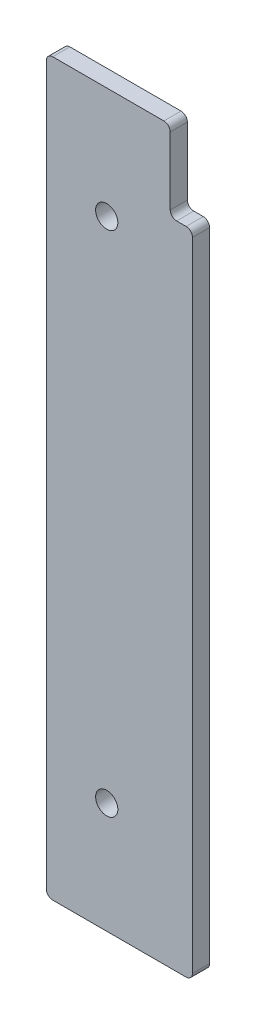
ISO-10303-21;
HEADER;
FILE_DESCRIPTION(('STEP AP214'),'2;1');
FILE_NAME('part.step','',(''),(''),'','','');
FILE_SCHEMA(('AUTOMOTIVE_DESIGN { 1 0 10303 214 1 1 1 1 }'));
ENDSEC;
DATA;
#1=APPLICATION_CONTEXT('core data for automotive mechanical design processes');
#2=APPLICATION_PROTOCOL_DEFINITION('international standard','automotive_design',2000,#1);
#3=PRODUCT_CONTEXT('',#1,'mechanical');
#4=PRODUCT('Part','Part','',(#3));
#5=PRODUCT_RELATED_PRODUCT_CATEGORY('part','',(#4));
#6=PRODUCT_DEFINITION_FORMATION('','',#4);
#7=PRODUCT_DEFINITION_CONTEXT('part definition',#1,'design');
#8=PRODUCT_DEFINITION('design','',#6,#7);
#9=PRODUCT_DEFINITION_SHAPE('','',#8);
#10=(LENGTH_UNIT() NAMED_UNIT(*) SI_UNIT(.MILLI.,.METRE.));
#11=(NAMED_UNIT(*) PLANE_ANGLE_UNIT() SI_UNIT($,.RADIAN.));
#12=(NAMED_UNIT(*) SI_UNIT($,.STERADIAN.) SOLID_ANGLE_UNIT());
#13=UNCERTAINTY_MEASURE_WITH_UNIT(LENGTH_MEASURE(1.E-05),#10,'distance_accuracy_value','');
#14=(GEOMETRIC_REPRESENTATION_CONTEXT(3) GLOBAL_UNCERTAINTY_ASSIGNED_CONTEXT((#13)) GLOBAL_UNIT_ASSIGNED_CONTEXT((#10,
#11,#12)) REPRESENTATION_CONTEXT('',''));
#15=CARTESIAN_POINT('',(0.,0.,0.));
#16=DIRECTION('',(0.,0.,1.));
#17=DIRECTION('',(1.,0.,0.));
#18=AXIS2_PLACEMENT_3D('',#15,#16,#17);
#19=CARTESIAN_POINT('',(142.500000000002,204.819306835417,2.7));
#20=DIRECTION('',(0.,0.,-1.));
#21=DIRECTION('',(-1.,0.,0.));
#22=AXIS2_PLACEMENT_3D('',#19,#20,#21);
#23=PLANE('',#22);
#24=CARTESIAN_POINT('',(142.500000000002,204.819306835417,2.7));
#25=DIRECTION('',(0.,0.,1.));
#26=DIRECTION('',(-1.,0.,0.));
#27=AXIS2_PLACEMENT_3D('',#24,#25,#26);
#28=CIRCLE('',#27,1.);
#29=CARTESIAN_POINT('',(143.500000000002,204.819306835417,2.7));
#30=VERTEX_POINT('',#29);
#31=CARTESIAN_POINT('',(142.500000000002,205.819306835417,2.7));
#32=VERTEX_POINT('',#31);
#33=EDGE_CURVE('E204',#30,#32,#28,.T.);
#34=ORIENTED_EDGE('',*,*,#33,.T.);
#35=DIRECTION('',(-1.,0.,0.));
#36=VECTOR('',#35,1.);
#37=CARTESIAN_POINT('',(142.500000000002,205.819306835417,2.7));
#38=LINE('',#37,#36);
#39=CARTESIAN_POINT('',(141.000000000002,205.819306835417,2.7));
#40=VERTEX_POINT('',#39);
#41=EDGE_CURVE('E116',#32,#40,#38,.T.);
#42=ORIENTED_EDGE('',*,*,#41,.T.);
#43=CARTESIAN_POINT('',(141.000000000002,206.819306835417,2.7));
#44=DIRECTION('',(0.,0.,-1.));
#45=DIRECTION('',(-1.,0.,0.));
#46=AXIS2_PLACEMENT_3D('',#43,#44,#45);
#47=CIRCLE('',#46,1.);
#48=CARTESIAN_POINT('',(140.000000000002,206.819306835417,2.7));
#49=VERTEX_POINT('',#48);
#50=EDGE_CURVE('E241',#40,#49,#47,.T.);
#51=ORIENTED_EDGE('',*,*,#50,.T.);
#52=DIRECTION('',(0.,1.,0.));
#53=VECTOR('',#52,1.);
#54=CARTESIAN_POINT('',(140.000000000002,206.819306835417,2.7));
#55=LINE('',#54,#53);
#56=CARTESIAN_POINT('',(140.000000000002,217.457909005974,2.7));
#57=VERTEX_POINT('',#56);
#58=EDGE_CURVE('E261',#49,#57,#55,.T.);
#59=ORIENTED_EDGE('',*,*,#58,.T.);
#60=CARTESIAN_POINT('',(139.000000000002,217.457909005974,2.7));
#61=DIRECTION('',(0.,0.,1.));
#62=DIRECTION('',(1.,0.,0.));
#63=AXIS2_PLACEMENT_3D('',#60,#61,#62);
#64=CIRCLE('',#63,1.);
#65=CARTESIAN_POINT('',(139.000000000002,218.457909005974,2.7));
#66=VERTEX_POINT('',#65);
#67=EDGE_CURVE('E257',#57,#66,#64,.T.);
#68=ORIENTED_EDGE('',*,*,#67,.T.);
#69=DIRECTION('',(-1.,0.,0.));
#70=VECTOR('',#69,1.);
#71=CARTESIAN_POINT('',(121.500000000002,218.457909005974,2.7));
#72=LINE('',#71,#70);
#73=CARTESIAN_POINT('',(121.500000000002,218.457909005974,2.7));
#74=VERTEX_POINT('',#73);
#75=EDGE_CURVE('E260',#66,#74,#72,.T.);
#76=ORIENTED_EDGE('',*,*,#75,.T.);
#77=CARTESIAN_POINT('',(121.500000000002,217.457909005974,2.7));
#78=DIRECTION('',(0.,0.,1.));
#79=DIRECTION('',(1.,0.,0.));
#80=AXIS2_PLACEMENT_3D('',#77,#78,#79);
#81=CIRCLE('',#80,1.);
#82=CARTESIAN_POINT('',(120.500000000002,217.457909005974,2.7));
#83=VERTEX_POINT('',#82);
#84=EDGE_CURVE('E265',#74,#83,#81,.T.);
#85=ORIENTED_EDGE('',*,*,#84,.T.);
#86=DIRECTION('',(0.,-1.,0.));
#87=VECTOR('',#86,1.);
#88=CARTESIAN_POINT('',(120.500000000002,217.457909005974,2.7));
#89=LINE('',#88,#87);
#90=CARTESIAN_POINT('',(120.500000000002,104.457909005974,2.7));
#91=VERTEX_POINT('',#90);
#92=EDGE_CURVE('E272',#83,#91,#89,.T.);
#93=ORIENTED_EDGE('',*,*,#92,.T.);
#94=CARTESIAN_POINT('',(121.500000000002,104.457909005974,2.7));
#95=DIRECTION('',(0.,0.,1.));
#96=DIRECTION('',(1.,0.,0.));
#97=AXIS2_PLACEMENT_3D('',#94,#95,#96);
#98=CIRCLE('',#97,1.);
#99=CARTESIAN_POINT('',(121.500000000002,103.457909005974,2.7));
#100=VERTEX_POINT('',#99);
#101=EDGE_CURVE('E147',#91,#100,#98,.T.);
#102=ORIENTED_EDGE('',*,*,#101,.T.);
#103=DIRECTION('',(1.,0.,0.));
#104=VECTOR('',#103,1.);
#105=CARTESIAN_POINT('',(121.500000000002,103.457909005974,2.7));
#106=LINE('',#105,#104);
#107=CARTESIAN_POINT('',(142.500000000002,103.457909005974,2.7));
#108=VERTEX_POINT('',#107);
#109=EDGE_CURVE('E141',#100,#108,#106,.T.);
#110=ORIENTED_EDGE('',*,*,#109,.T.);
#111=CARTESIAN_POINT('',(142.500000000002,104.457909005974,2.7));
#112=DIRECTION('',(0.,0.,1.));
#113=DIRECTION('',(1.,0.,0.));
#114=AXIS2_PLACEMENT_3D('',#111,#112,#113);
#115=CIRCLE('',#114,1.);
#116=CARTESIAN_POINT('',(143.500000000002,104.457909005974,2.7));
#117=VERTEX_POINT('',#116);
#118=EDGE_CURVE('E145',#108,#117,#115,.T.);
#119=ORIENTED_EDGE('',*,*,#118,.T.);
#120=DIRECTION('',(0.,1.,0.));
#121=VECTOR('',#120,1.);
#122=CARTESIAN_POINT('',(143.500000000002,204.819306835417,2.7));
#123=LINE('',#122,#121);
#124=EDGE_CURVE('E61',#117,#30,#123,.T.);
#125=ORIENTED_EDGE('',*,*,#124,.T.);
#126=EDGE_LOOP('',(#34,#42,#51,#59,#68,#76,#85,#93,#102,#110,#119,#125));
#127=FACE_BOUND('',#126,.T.);
#128=CARTESIAN_POINT('',(130.000000000002,200.941258447184,2.7));
#129=DIRECTION('',(0.,0.,1.));
#130=DIRECTION('',(1.,0.,0.));
#131=AXIS2_PLACEMENT_3D('',#128,#129,#130);
#132=CIRCLE('',#131,1.75000000000001);
#133=CARTESIAN_POINT('',(128.250000000002,200.941258447184,2.7));
#134=VERTEX_POINT('',#133);
#135=EDGE_CURVE('E174',#134,#134,#132,.T.);
#136=ORIENTED_EDGE('',*,*,#135,.F.);
#137=EDGE_LOOP('',(#136));
#138=FACE_BOUND('',#137,.T.);
#139=CARTESIAN_POINT('',(130.000000000002,120.941258447184,2.7));
#140=DIRECTION('',(0.,0.,1.));
#141=DIRECTION('',(1.,0.,0.));
#142=AXIS2_PLACEMENT_3D('',#139,#140,#141);
#143=CIRCLE('',#142,1.75000000000001);
#144=CARTESIAN_POINT('',(128.250000000002,120.941258447184,2.7));
#145=VERTEX_POINT('',#144);
#146=EDGE_CURVE('E315',#145,#145,#143,.T.);
#147=ORIENTED_EDGE('',*,*,#146,.F.);
#148=EDGE_LOOP('',(#147));
#149=FACE_BOUND('',#148,.T.);
#150=ADVANCED_FACE('F43',(#127,#138,#149),#23,.F.);
#151=CARTESIAN_POINT('',(142.500000000002,204.819306835417,0.));
#152=DIRECTION('',(0.,0.,-1.));
#153=DIRECTION('',(-1.,0.,0.));
#154=AXIS2_PLACEMENT_3D('',#151,#152,#153);
#155=PLANE('',#154);
#156=CARTESIAN_POINT('',(130.000000000002,200.941258447184,0.));
#157=DIRECTION('',(0.,0.,1.));
#158=DIRECTION('',(1.,0.,0.));
#159=AXIS2_PLACEMENT_3D('',#156,#157,#158);
#160=CIRCLE('',#159,1.75000000000001);
#161=CARTESIAN_POINT('',(128.250000000002,200.941258447184,0.));
#162=VERTEX_POINT('',#161);
#163=EDGE_CURVE('E322',#162,#162,#160,.T.);
#164=ORIENTED_EDGE('',*,*,#163,.T.);
#165=EDGE_LOOP('',(#164));
#166=FACE_BOUND('',#165,.T.);
#167=CARTESIAN_POINT('',(142.500000000002,204.819306835417,0.));
#168=DIRECTION('',(0.,0.,1.));
#169=DIRECTION('',(-1.,0.,0.));
#170=AXIS2_PLACEMENT_3D('',#167,#168,#169);
#171=CIRCLE('',#170,1.);
#172=CARTESIAN_POINT('',(143.500000000002,204.819306835417,0.));
#173=VERTEX_POINT('',#172);
#174=CARTESIAN_POINT('',(142.500000000002,205.819306835417,0.));
#175=VERTEX_POINT('',#174);
#176=EDGE_CURVE('E169',#173,#175,#171,.T.);
#177=ORIENTED_EDGE('',*,*,#176,.F.);
#178=DIRECTION('',(0.,1.,0.));
#179=VECTOR('',#178,1.);
#180=CARTESIAN_POINT('',(143.500000000002,204.819306835417,0.));
#181=LINE('',#180,#179);
#182=CARTESIAN_POINT('',(143.500000000002,104.457909005974,0.));
#183=VERTEX_POINT('',#182);
#184=EDGE_CURVE('E108',#183,#173,#181,.T.);
#185=ORIENTED_EDGE('',*,*,#184,.F.);
#186=CARTESIAN_POINT('',(142.500000000002,104.457909005974,0.));
#187=DIRECTION('',(0.,0.,1.));
#188=DIRECTION('',(1.,0.,0.));
#189=AXIS2_PLACEMENT_3D('',#186,#187,#188);
#190=CIRCLE('',#189,1.);
#191=CARTESIAN_POINT('',(142.500000000002,103.457909005974,0.));
#192=VERTEX_POINT('',#191);
#193=EDGE_CURVE('E102',#192,#183,#190,.T.);
#194=ORIENTED_EDGE('',*,*,#193,.F.);
#195=DIRECTION('',(1.,0.,0.));
#196=VECTOR('',#195,1.);
#197=CARTESIAN_POINT('',(121.500000000002,103.457909005974,0.));
#198=LINE('',#197,#196);
#199=CARTESIAN_POINT('',(121.500000000002,103.457909005974,0.));
#200=VERTEX_POINT('',#199);
#201=EDGE_CURVE('E156',#200,#192,#198,.T.);
#202=ORIENTED_EDGE('',*,*,#201,.F.);
#203=CARTESIAN_POINT('',(121.500000000002,104.457909005974,0.));
#204=DIRECTION('',(0.,0.,1.));
#205=DIRECTION('',(1.,0.,0.));
#206=AXIS2_PLACEMENT_3D('',#203,#204,#205);
#207=CIRCLE('',#206,1.);
#208=CARTESIAN_POINT('',(120.500000000002,104.457909005974,0.));
#209=VERTEX_POINT('',#208);
#210=EDGE_CURVE('E195',#209,#200,#207,.T.);
#211=ORIENTED_EDGE('',*,*,#210,.F.);
#212=DIRECTION('',(0.,-1.,0.));
#213=VECTOR('',#212,1.);
#214=CARTESIAN_POINT('',(120.500000000002,217.457909005974,0.));
#215=LINE('',#214,#213);
#216=CARTESIAN_POINT('',(120.500000000002,217.457909005974,0.));
#217=VERTEX_POINT('',#216);
#218=EDGE_CURVE('E192',#217,#209,#215,.T.);
#219=ORIENTED_EDGE('',*,*,#218,.F.);
#220=CARTESIAN_POINT('',(121.500000000002,217.457909005974,0.));
#221=DIRECTION('',(0.,0.,1.));
#222=DIRECTION('',(1.,0.,0.));
#223=AXIS2_PLACEMENT_3D('',#220,#221,#222);
#224=CIRCLE('',#223,1.);
#225=CARTESIAN_POINT('',(121.500000000002,218.457909005974,0.));
#226=VERTEX_POINT('',#225);
#227=EDGE_CURVE('E189',#226,#217,#224,.T.);
#228=ORIENTED_EDGE('',*,*,#227,.F.);
#229=DIRECTION('',(-1.,0.,0.));
#230=VECTOR('',#229,1.);
#231=CARTESIAN_POINT('',(121.500000000002,218.457909005974,0.));
#232=LINE('',#231,#230);
#233=CARTESIAN_POINT('',(139.000000000002,218.457909005974,0.));
#234=VERTEX_POINT('',#233);
#235=EDGE_CURVE('E186',#234,#226,#232,.T.);
#236=ORIENTED_EDGE('',*,*,#235,.F.);
#237=CARTESIAN_POINT('',(139.000000000002,217.457909005974,0.));
#238=DIRECTION('',(0.,0.,1.));
#239=DIRECTION('',(1.,0.,0.));
#240=AXIS2_PLACEMENT_3D('',#237,#238,#239);
#241=CIRCLE('',#240,1.);
#242=CARTESIAN_POINT('',(140.000000000002,217.457909005974,0.));
#243=VERTEX_POINT('',#242);
#244=EDGE_CURVE('E183',#243,#234,#241,.T.);
#245=ORIENTED_EDGE('',*,*,#244,.F.);
#246=DIRECTION('',(0.,1.,0.));
#247=VECTOR('',#246,1.);
#248=CARTESIAN_POINT('',(140.000000000002,206.819306835417,0.));
#249=LINE('',#248,#247);
#250=CARTESIAN_POINT('',(140.000000000002,206.819306835417,0.));
#251=VERTEX_POINT('',#250);
#252=EDGE_CURVE('E180',#251,#243,#249,.T.);
#253=ORIENTED_EDGE('',*,*,#252,.F.);
#254=CARTESIAN_POINT('',(141.000000000002,206.819306835417,0.));
#255=DIRECTION('',(0.,0.,-1.));
#256=DIRECTION('',(-1.,0.,0.));
#257=AXIS2_PLACEMENT_3D('',#254,#255,#256);
#258=CIRCLE('',#257,1.);
#259=CARTESIAN_POINT('',(141.000000000002,205.819306835417,0.));
#260=VERTEX_POINT('',#259);
#261=EDGE_CURVE('E177',#260,#251,#258,.T.);
#262=ORIENTED_EDGE('',*,*,#261,.F.);
#263=DIRECTION('',(-1.,0.,0.));
#264=VECTOR('',#263,1.);
#265=CARTESIAN_POINT('',(142.500000000002,205.819306835417,0.));
#266=LINE('',#265,#264);
#267=EDGE_CURVE('E173',#175,#260,#266,.T.);
#268=ORIENTED_EDGE('',*,*,#267,.F.);
#269=EDGE_LOOP('',(#177,#185,#194,#202,#211,#219,#228,#236,#245,#253,#262,#268));
#270=FACE_BOUND('',#269,.T.);
#271=CARTESIAN_POINT('',(130.000000000002,120.941258447184,0.));
#272=DIRECTION('',(0.,0.,1.));
#273=DIRECTION('',(1.,0.,0.));
#274=AXIS2_PLACEMENT_3D('',#271,#272,#273);
#275=CIRCLE('',#274,1.75000000000001);
#276=CARTESIAN_POINT('',(128.250000000002,120.941258447184,0.));
#277=VERTEX_POINT('',#276);
#278=EDGE_CURVE('E318',#277,#277,#275,.T.);
#279=ORIENTED_EDGE('',*,*,#278,.T.);
#280=EDGE_LOOP('',(#279));
#281=FACE_BOUND('',#280,.T.);
#282=ADVANCED_FACE('F245',(#166,#270,#281),#155,.T.);
#283=CARTESIAN_POINT('',(142.500000000002,204.819306835417,2.7));
#284=DIRECTION('',(0.,0.,-1.));
#285=DIRECTION('',(-1.,0.,0.));
#286=AXIS2_PLACEMENT_3D('',#283,#284,#285);
#287=CYLINDRICAL_SURFACE('',#286,1.);
#288=ORIENTED_EDGE('',*,*,#176,.T.);
#289=DIRECTION('',(0.,0.,-1.));
#290=VECTOR('',#289,1.);
#291=CARTESIAN_POINT('',(142.500000000002,205.819306835417,2.7));
#292=LINE('',#291,#290);
#293=EDGE_CURVE('E11',#32,#175,#292,.T.);
#294=ORIENTED_EDGE('',*,*,#293,.F.);
#295=ORIENTED_EDGE('',*,*,#33,.F.);
#296=DIRECTION('',(0.,0.,-1.));
#297=VECTOR('',#296,1.);
#298=CARTESIAN_POINT('',(143.500000000002,204.819306835417,2.7));
#299=LINE('',#298,#297);
#300=EDGE_CURVE('E165',#30,#173,#299,.T.);
#301=ORIENTED_EDGE('',*,*,#300,.T.);
#302=EDGE_LOOP('',(#288,#294,#295,#301));
#303=FACE_BOUND('',#302,.T.);
#304=ADVANCED_FACE('F45',(#303),#287,.T.);
#305=CARTESIAN_POINT('',(142.500000000002,205.819306835417,2.7));
#306=DIRECTION('',(0.,-1.,0.));
#307=DIRECTION('',(0.,0.,-1.));
#308=AXIS2_PLACEMENT_3D('',#305,#306,#307);
#309=PLANE('',#308);
#310=ORIENTED_EDGE('',*,*,#267,.T.);
#311=DIRECTION('',(0.,0.,-1.));
#312=VECTOR('',#311,1.);
#313=CARTESIAN_POINT('',(141.000000000002,205.819306835417,2.7));
#314=LINE('',#313,#312);
#315=EDGE_CURVE('E53',#40,#260,#314,.T.);
#316=ORIENTED_EDGE('',*,*,#315,.F.);
#317=ORIENTED_EDGE('',*,*,#41,.F.);
#318=ORIENTED_EDGE('',*,*,#293,.T.);
#319=EDGE_LOOP('',(#310,#316,#317,#318));
#320=FACE_BOUND('',#319,.T.);
#321=ADVANCED_FACE('F432',(#320),#309,.F.);
#322=CARTESIAN_POINT('',(141.000000000002,206.819306835417,2.7));
#323=DIRECTION('',(0.,0.,-1.));
#324=DIRECTION('',(-1.,0.,0.));
#325=AXIS2_PLACEMENT_3D('',#322,#323,#324);
#326=CYLINDRICAL_SURFACE('',#325,1.);
#327=ORIENTED_EDGE('',*,*,#261,.T.);
#328=DIRECTION('',(0.,0.,-1.));
#329=VECTOR('',#328,1.);
#330=CARTESIAN_POINT('',(140.000000000002,206.819306835417,2.7));
#331=LINE('',#330,#329);
#332=EDGE_CURVE('E231',#49,#251,#331,.T.);
#333=ORIENTED_EDGE('',*,*,#332,.F.);
#334=ORIENTED_EDGE('',*,*,#50,.F.);
#335=ORIENTED_EDGE('',*,*,#315,.T.);
#336=EDGE_LOOP('',(#327,#333,#334,#335));
#337=FACE_BOUND('',#336,.T.);
#338=ADVANCED_FACE('F239',(#337),#326,.F.);
#339=CARTESIAN_POINT('',(140.000000000002,206.819306835417,2.7));
#340=DIRECTION('',(-1.,0.,0.));
#341=DIRECTION('',(0.,0.,1.));
#342=AXIS2_PLACEMENT_3D('',#339,#340,#341);
#343=PLANE('',#342);
#344=ORIENTED_EDGE('',*,*,#252,.T.);
#345=DIRECTION('',(0.,0.,-1.));
#346=VECTOR('',#345,1.);
#347=CARTESIAN_POINT('',(140.000000000002,217.457909005974,2.7));
#348=LINE('',#347,#346);
#349=EDGE_CURVE('E227',#57,#243,#348,.T.);
#350=ORIENTED_EDGE('',*,*,#349,.F.);
#351=ORIENTED_EDGE('',*,*,#58,.F.);
#352=ORIENTED_EDGE('',*,*,#332,.T.);
#353=EDGE_LOOP('',(#344,#350,#351,#352));
#354=FACE_BOUND('',#353,.T.);
#355=ADVANCED_FACE('F251',(#354),#343,.F.);
#356=CARTESIAN_POINT('',(139.000000000002,217.457909005974,2.7));
#357=DIRECTION('',(0.,0.,-1.));
#358=DIRECTION('',(-1.,0.,0.));
#359=AXIS2_PLACEMENT_3D('',#356,#357,#358);
#360=CYLINDRICAL_SURFACE('',#359,1.);
#361=ORIENTED_EDGE('',*,*,#244,.T.);
#362=DIRECTION('',(0.,0.,-1.));
#363=VECTOR('',#362,1.);
#364=CARTESIAN_POINT('',(139.000000000002,218.457909005974,2.7));
#365=LINE('',#364,#363);
#366=EDGE_CURVE('E223',#66,#234,#365,.T.);
#367=ORIENTED_EDGE('',*,*,#366,.F.);
#368=ORIENTED_EDGE('',*,*,#67,.F.);
#369=ORIENTED_EDGE('',*,*,#349,.T.);
#370=EDGE_LOOP('',(#361,#367,#368,#369));
#371=FACE_BOUND('',#370,.T.);
#372=ADVANCED_FACE('F255',(#371),#360,.T.);
#373=CARTESIAN_POINT('',(121.500000000002,218.457909005974,2.7));
#374=DIRECTION('',(0.,-1.,0.));
#375=DIRECTION('',(1.,0.,0.));
#376=AXIS2_PLACEMENT_3D('',#373,#374,#375);
#377=PLANE('',#376);
#378=ORIENTED_EDGE('',*,*,#235,.T.);
#379=DIRECTION('',(0.,0.,-1.));
#380=VECTOR('',#379,1.);
#381=CARTESIAN_POINT('',(121.500000000002,218.457909005974,2.7));
#382=LINE('',#381,#380);
#383=EDGE_CURVE('E219',#74,#226,#382,.T.);
#384=ORIENTED_EDGE('',*,*,#383,.F.);
#385=ORIENTED_EDGE('',*,*,#75,.F.);
#386=ORIENTED_EDGE('',*,*,#366,.T.);
#387=EDGE_LOOP('',(#378,#384,#385,#386));
#388=FACE_BOUND('',#387,.T.);
#389=ADVANCED_FACE('F393',(#388),#377,.F.);
#390=CARTESIAN_POINT('',(121.500000000002,217.457909005974,2.7));
#391=DIRECTION('',(0.,0.,-1.));
#392=DIRECTION('',(-1.,0.,0.));
#393=AXIS2_PLACEMENT_3D('',#390,#391,#392);
#394=CYLINDRICAL_SURFACE('',#393,1.);
#395=ORIENTED_EDGE('',*,*,#227,.T.);
#396=DIRECTION('',(0.,0.,-1.));
#397=VECTOR('',#396,1.);
#398=CARTESIAN_POINT('',(120.500000000002,217.457909005974,2.7));
#399=LINE('',#398,#397);
#400=EDGE_CURVE('E215',#83,#217,#399,.T.);
#401=ORIENTED_EDGE('',*,*,#400,.F.);
#402=ORIENTED_EDGE('',*,*,#84,.F.);
#403=ORIENTED_EDGE('',*,*,#383,.T.);
#404=EDGE_LOOP('',(#395,#401,#402,#403));
#405=FACE_BOUND('',#404,.T.);
#406=ADVANCED_FACE('F383',(#405),#394,.T.);
#407=CARTESIAN_POINT('',(120.500000000002,217.457909005974,2.7));
#408=DIRECTION('',(1.,0.,0.));
#409=DIRECTION('',(0.,0.,-1.));
#410=AXIS2_PLACEMENT_3D('',#407,#408,#409);
#411=PLANE('',#410);
#412=ORIENTED_EDGE('',*,*,#218,.T.);
#413=DIRECTION('',(0.,0.,-1.));
#414=VECTOR('',#413,1.);
#415=CARTESIAN_POINT('',(120.500000000002,104.457909005974,2.7));
#416=LINE('',#415,#414);
#417=EDGE_CURVE('E211',#91,#209,#416,.T.);
#418=ORIENTED_EDGE('',*,*,#417,.F.);
#419=ORIENTED_EDGE('',*,*,#92,.F.);
#420=ORIENTED_EDGE('',*,*,#400,.T.);
#421=EDGE_LOOP('',(#412,#418,#419,#420));
#422=FACE_BOUND('',#421,.T.);
#423=ADVANCED_FACE('F280',(#422),#411,.F.);
#424=CARTESIAN_POINT('',(121.500000000002,104.457909005974,2.7));
#425=DIRECTION('',(0.,0.,-1.));
#426=DIRECTION('',(-1.,0.,0.));
#427=AXIS2_PLACEMENT_3D('',#424,#425,#426);
#428=CYLINDRICAL_SURFACE('',#427,1.);
#429=ORIENTED_EDGE('',*,*,#210,.T.);
#430=DIRECTION('',(0.,0.,-1.));
#431=VECTOR('',#430,1.);
#432=CARTESIAN_POINT('',(121.500000000002,103.457909005974,2.7));
#433=LINE('',#432,#431);
#434=EDGE_CURVE('E158',#100,#200,#433,.T.);
#435=ORIENTED_EDGE('',*,*,#434,.F.);
#436=ORIENTED_EDGE('',*,*,#101,.F.);
#437=ORIENTED_EDGE('',*,*,#417,.T.);
#438=EDGE_LOOP('',(#429,#435,#436,#437));
#439=FACE_BOUND('',#438,.T.);
#440=ADVANCED_FACE('F284',(#439),#428,.T.);
#441=CARTESIAN_POINT('',(121.500000000002,103.457909005974,2.7));
#442=DIRECTION('',(0.,1.,0.));
#443=DIRECTION('',(-1.,0.,0.));
#444=AXIS2_PLACEMENT_3D('',#441,#442,#443);
#445=PLANE('',#444);
#446=ORIENTED_EDGE('',*,*,#201,.T.);
#447=DIRECTION('',(0.,0.,-1.));
#448=VECTOR('',#447,1.);
#449=CARTESIAN_POINT('',(142.500000000002,103.457909005974,2.7));
#450=LINE('',#449,#448);
#451=EDGE_CURVE('E153',#108,#192,#450,.T.);
#452=ORIENTED_EDGE('',*,*,#451,.F.);
#453=ORIENTED_EDGE('',*,*,#109,.F.);
#454=ORIENTED_EDGE('',*,*,#434,.T.);
#455=EDGE_LOOP('',(#446,#452,#453,#454));
#456=FACE_BOUND('',#455,.T.);
#457=ADVANCED_FACE('F154',(#456),#445,.F.);
#458=CARTESIAN_POINT('',(142.500000000002,104.457909005974,2.7));
#459=DIRECTION('',(0.,0.,-1.));
#460=DIRECTION('',(-1.,0.,0.));
#461=AXIS2_PLACEMENT_3D('',#458,#459,#460);
#462=CYLINDRICAL_SURFACE('',#461,1.);
#463=ORIENTED_EDGE('',*,*,#193,.T.);
#464=DIRECTION('',(0.,0.,-1.));
#465=VECTOR('',#464,1.);
#466=CARTESIAN_POINT('',(143.500000000002,104.457909005974,2.7));
#467=LINE('',#466,#465);
#468=EDGE_CURVE('E159',#117,#183,#467,.T.);
#469=ORIENTED_EDGE('',*,*,#468,.F.);
#470=ORIENTED_EDGE('',*,*,#118,.F.);
#471=ORIENTED_EDGE('',*,*,#451,.T.);
#472=EDGE_LOOP('',(#463,#469,#470,#471));
#473=FACE_BOUND('',#472,.T.);
#474=ADVANCED_FACE('F161',(#473),#462,.T.);
#475=CARTESIAN_POINT('',(143.500000000002,204.819306835417,2.7));
#476=DIRECTION('',(-1.,0.,0.));
#477=DIRECTION('',(0.,-1.,0.));
#478=AXIS2_PLACEMENT_3D('',#475,#476,#477);
#479=PLANE('',#478);
#480=ORIENTED_EDGE('',*,*,#184,.T.);
#481=ORIENTED_EDGE('',*,*,#300,.F.);
#482=ORIENTED_EDGE('',*,*,#124,.F.);
#483=ORIENTED_EDGE('',*,*,#468,.T.);
#484=EDGE_LOOP('',(#480,#481,#482,#483));
#485=FACE_BOUND('',#484,.T.);
#486=ADVANCED_FACE('F288',(#485),#479,.F.);
#487=CARTESIAN_POINT('',(130.000000000002,200.941258447184,2.7));
#488=DIRECTION('',(0.,0.,-1.));
#489=DIRECTION('',(-1.,0.,0.));
#490=AXIS2_PLACEMENT_3D('',#487,#488,#489);
#491=CYLINDRICAL_SURFACE('',#490,1.75000000000001);
#492=CARTESIAN_POINT('',(128.250000000002,200.941258447184,2.7));
#493=CARTESIAN_POINT('',(128.250000000002,200.941258447184,2.671875));
#494=CARTESIAN_POINT('',(128.250000000002,200.941258447184,2.64375));
#495=CARTESIAN_POINT('',(128.250000000002,200.941258447184,2.5875));
#496=CARTESIAN_POINT('',(128.250000000002,200.941258447184,2.559375));
#497=CARTESIAN_POINT('',(128.250000000002,200.941258447184,2.503125));
#498=CARTESIAN_POINT('',(128.250000000002,200.941258447184,2.475));
#499=CARTESIAN_POINT('',(128.250000000002,200.941258447184,2.41875));
#500=CARTESIAN_POINT('',(128.250000000002,200.941258447184,2.390625));
#501=CARTESIAN_POINT('',(128.250000000002,200.941258447184,2.334375));
#502=CARTESIAN_POINT('',(128.250000000002,200.941258447184,2.30625));
#503=CARTESIAN_POINT('',(128.250000000002,200.941258447184,2.25));
#504=CARTESIAN_POINT('',(128.250000000002,200.941258447184,2.221875));
#505=CARTESIAN_POINT('',(128.250000000002,200.941258447184,2.165625));
#506=CARTESIAN_POINT('',(128.250000000002,200.941258447184,2.1375));
#507=CARTESIAN_POINT('',(128.250000000002,200.941258447184,2.08125));
#508=CARTESIAN_POINT('',(128.250000000002,200.941258447184,2.053125));
#509=CARTESIAN_POINT('',(128.250000000002,200.941258447184,1.996875));
#510=CARTESIAN_POINT('',(128.250000000002,200.941258447184,1.96875));
#511=CARTESIAN_POINT('',(128.250000000002,200.941258447184,1.9125));
#512=CARTESIAN_POINT('',(128.250000000002,200.941258447184,1.884375));
#513=CARTESIAN_POINT('',(128.250000000002,200.941258447184,1.828125));
#514=CARTESIAN_POINT('',(128.250000000002,200.941258447184,1.8));
#515=CARTESIAN_POINT('',(128.250000000002,200.941258447184,1.74375));
#516=CARTESIAN_POINT('',(128.250000000002,200.941258447184,1.715625));
#517=CARTESIAN_POINT('',(128.250000000002,200.941258447184,1.659375));
#518=CARTESIAN_POINT('',(128.250000000002,200.941258447184,1.63125));
#519=CARTESIAN_POINT('',(128.250000000002,200.941258447184,1.575));
#520=CARTESIAN_POINT('',(128.250000000002,200.941258447184,1.546875));
#521=CARTESIAN_POINT('',(128.250000000002,200.941258447184,1.490625));
#522=CARTESIAN_POINT('',(128.250000000002,200.941258447184,1.4625));
#523=CARTESIAN_POINT('',(128.250000000002,200.941258447184,1.40625));
#524=CARTESIAN_POINT('',(128.250000000002,200.941258447184,1.378125));
#525=CARTESIAN_POINT('',(128.250000000002,200.941258447184,1.321875));
#526=CARTESIAN_POINT('',(128.250000000002,200.941258447184,1.29375));
#527=CARTESIAN_POINT('',(128.250000000002,200.941258447184,1.2375));
#528=CARTESIAN_POINT('',(128.250000000002,200.941258447184,1.209375));
#529=CARTESIAN_POINT('',(128.250000000002,200.941258447184,1.153125));
#530=CARTESIAN_POINT('',(128.250000000002,200.941258447184,1.125));
#531=CARTESIAN_POINT('',(128.250000000002,200.941258447184,1.06875));
#532=CARTESIAN_POINT('',(128.250000000002,200.941258447184,1.040625));
#533=CARTESIAN_POINT('',(128.250000000002,200.941258447184,0.984375));
#534=CARTESIAN_POINT('',(128.250000000002,200.941258447184,0.956249999999999));
#535=CARTESIAN_POINT('',(128.250000000002,200.941258447184,0.899999999999999));
#536=CARTESIAN_POINT('',(128.250000000002,200.941258447184,0.871875));
#537=CARTESIAN_POINT('',(128.250000000002,200.941258447184,0.815624999999999));
#538=CARTESIAN_POINT('',(128.250000000002,200.941258447184,0.787499999999999));
#539=CARTESIAN_POINT('',(128.250000000002,200.941258447184,0.73125));
#540=CARTESIAN_POINT('',(128.250000000002,200.941258447184,0.703125));
#541=CARTESIAN_POINT('',(128.250000000002,200.941258447184,0.646875));
#542=CARTESIAN_POINT('',(128.250000000002,200.941258447184,0.61875));
#543=CARTESIAN_POINT('',(128.250000000002,200.941258447184,0.5625));
#544=CARTESIAN_POINT('',(128.250000000002,200.941258447184,0.534375));
#545=CARTESIAN_POINT('',(128.250000000002,200.941258447184,0.478125));
#546=CARTESIAN_POINT('',(128.250000000002,200.941258447184,0.45));
#547=CARTESIAN_POINT('',(128.250000000002,200.941258447184,0.39375));
#548=CARTESIAN_POINT('',(128.250000000002,200.941258447184,0.365625));
#549=CARTESIAN_POINT('',(128.250000000002,200.941258447184,0.309375));
#550=CARTESIAN_POINT('',(128.250000000002,200.941258447184,0.28125));
#551=CARTESIAN_POINT('',(128.250000000002,200.941258447184,0.225));
#552=CARTESIAN_POINT('',(128.250000000002,200.941258447184,0.196875));
#553=CARTESIAN_POINT('',(128.250000000002,200.941258447184,0.140625));
#554=CARTESIAN_POINT('',(128.250000000002,200.941258447184,0.1125));
#555=CARTESIAN_POINT('',(128.250000000002,200.941258447184,0.0562499999999997));
#556=CARTESIAN_POINT('',(128.250000000002,200.941258447184,0.0281249999999996));
#557=CARTESIAN_POINT('',(128.250000000002,200.941258447184,0.));
#558=B_SPLINE_CURVE_WITH_KNOTS('',3,(#492,#493,#494,#495,#496,#497,#498,#499,#500,#501,#502,
#503,#504,#505,#506,#507,#508,#509,#510,#511,#512,#513,#514,#515,#516,#517,#518,#519,#520,#521,
#522,#523,#524,#525,#526,#527,#528,#529,#530,#531,#532,#533,#534,#535,#536,#537,#538,#539,#540,
#541,#542,#543,#544,#545,#546,#547,#548,#549,#550,#551,#552,#553,#554,#555,#556,#557),
.UNSPECIFIED.,.F.,.F.,(4,2,2,2,2,2,2,2,2,2,2,2,2,2,2,2,2,2,2,2,2,2,2,2,2,2,2,2,2,2,2,2,4),(0.,
0.0843750000000003,0.16875,0.253125,0.3375,0.421875,0.50625,0.590625,0.675,0.759375,0.84375,
0.928125000000001,1.0125,1.096875,1.18125,1.265625,1.35,1.434375,1.51875,1.603125,1.6875,
1.771875,1.85625,1.940625,2.025,2.109375,2.19375,2.278125,2.3625,2.446875,2.53125,2.615625,2.7),.UNSPECIFIED.);
#559=EDGE_CURVE('BSEAM290',#134,#162,#558,.T.);
#560=ORIENTED_EDGE('',*,*,#135,.T.);
#561=ORIENTED_EDGE('',*,*,#163,.F.);
#562=ORIENTED_EDGE('',*,*,#559,.T.);
#563=ORIENTED_EDGE('',*,*,#559,.F.);
#564=EDGE_LOOP('',(#560,#562,#561,#563));
#565=FACE_BOUND('',#564,.T.);
#566=ADVANCED_FACE('F290',(#565),#491,.F.);
#567=CARTESIAN_POINT('',(130.000000000002,120.941258447184,2.7));
#568=DIRECTION('',(0.,0.,-1.));
#569=DIRECTION('',(-1.,0.,0.));
#570=AXIS2_PLACEMENT_3D('',#567,#568,#569);
#571=CYLINDRICAL_SURFACE('',#570,1.75000000000001);
#572=CARTESIAN_POINT('',(128.250000000002,120.941258447184,2.7));
#573=CARTESIAN_POINT('',(128.250000000002,120.941258447184,2.671875));
#574=CARTESIAN_POINT('',(128.250000000002,120.941258447184,2.64375));
#575=CARTESIAN_POINT('',(128.250000000002,120.941258447184,2.5875));
#576=CARTESIAN_POINT('',(128.250000000002,120.941258447184,2.559375));
#577=CARTESIAN_POINT('',(128.250000000002,120.941258447184,2.503125));
#578=CARTESIAN_POINT('',(128.250000000002,120.941258447184,2.475));
#579=CARTESIAN_POINT('',(128.250000000002,120.941258447184,2.41875));
#580=CARTESIAN_POINT('',(128.250000000002,120.941258447184,2.390625));
#581=CARTESIAN_POINT('',(128.250000000002,120.941258447184,2.334375));
#582=CARTESIAN_POINT('',(128.250000000002,120.941258447184,2.30625));
#583=CARTESIAN_POINT('',(128.250000000002,120.941258447184,2.25));
#584=CARTESIAN_POINT('',(128.250000000002,120.941258447184,2.221875));
#585=CARTESIAN_POINT('',(128.250000000002,120.941258447184,2.165625));
#586=CARTESIAN_POINT('',(128.250000000002,120.941258447184,2.1375));
#587=CARTESIAN_POINT('',(128.250000000002,120.941258447184,2.08125));
#588=CARTESIAN_POINT('',(128.250000000002,120.941258447184,2.053125));
#589=CARTESIAN_POINT('',(128.250000000002,120.941258447184,1.996875));
#590=CARTESIAN_POINT('',(128.250000000002,120.941258447184,1.96875));
#591=CARTESIAN_POINT('',(128.250000000002,120.941258447184,1.9125));
#592=CARTESIAN_POINT('',(128.250000000002,120.941258447184,1.884375));
#593=CARTESIAN_POINT('',(128.250000000002,120.941258447184,1.828125));
#594=CARTESIAN_POINT('',(128.250000000002,120.941258447184,1.8));
#595=CARTESIAN_POINT('',(128.250000000002,120.941258447184,1.74375));
#596=CARTESIAN_POINT('',(128.250000000002,120.941258447184,1.715625));
#597=CARTESIAN_POINT('',(128.250000000002,120.941258447184,1.659375));
#598=CARTESIAN_POINT('',(128.250000000002,120.941258447184,1.63125));
#599=CARTESIAN_POINT('',(128.250000000002,120.941258447184,1.575));
#600=CARTESIAN_POINT('',(128.250000000002,120.941258447184,1.546875));
#601=CARTESIAN_POINT('',(128.250000000002,120.941258447184,1.490625));
#602=CARTESIAN_POINT('',(128.250000000002,120.941258447184,1.4625));
#603=CARTESIAN_POINT('',(128.250000000002,120.941258447184,1.40625));
#604=CARTESIAN_POINT('',(128.250000000002,120.941258447184,1.378125));
#605=CARTESIAN_POINT('',(128.250000000002,120.941258447184,1.321875));
#606=CARTESIAN_POINT('',(128.250000000002,120.941258447184,1.29375));
#607=CARTESIAN_POINT('',(128.250000000002,120.941258447184,1.2375));
#608=CARTESIAN_POINT('',(128.250000000002,120.941258447184,1.209375));
#609=CARTESIAN_POINT('',(128.250000000002,120.941258447184,1.153125));
#610=CARTESIAN_POINT('',(128.250000000002,120.941258447184,1.125));
#611=CARTESIAN_POINT('',(128.250000000002,120.941258447184,1.06875));
#612=CARTESIAN_POINT('',(128.250000000002,120.941258447184,1.040625));
#613=CARTESIAN_POINT('',(128.250000000002,120.941258447184,0.984375));
#614=CARTESIAN_POINT('',(128.250000000002,120.941258447184,0.956249999999999));
#615=CARTESIAN_POINT('',(128.250000000002,120.941258447184,0.899999999999999));
#616=CARTESIAN_POINT('',(128.250000000002,120.941258447184,0.871875));
#617=CARTESIAN_POINT('',(128.250000000002,120.941258447184,0.815624999999999));
#618=CARTESIAN_POINT('',(128.250000000002,120.941258447184,0.787499999999999));
#619=CARTESIAN_POINT('',(128.250000000002,120.941258447184,0.73125));
#620=CARTESIAN_POINT('',(128.250000000002,120.941258447184,0.703125));
#621=CARTESIAN_POINT('',(128.250000000002,120.941258447184,0.646875));
#622=CARTESIAN_POINT('',(128.250000000002,120.941258447184,0.61875));
#623=CARTESIAN_POINT('',(128.250000000002,120.941258447184,0.5625));
#624=CARTESIAN_POINT('',(128.250000000002,120.941258447184,0.534375));
#625=CARTESIAN_POINT('',(128.250000000002,120.941258447184,0.478125));
#626=CARTESIAN_POINT('',(128.250000000002,120.941258447184,0.45));
#627=CARTESIAN_POINT('',(128.250000000002,120.941258447184,0.39375));
#628=CARTESIAN_POINT('',(128.250000000002,120.941258447184,0.365625));
#629=CARTESIAN_POINT('',(128.250000000002,120.941258447184,0.309375));
#630=CARTESIAN_POINT('',(128.250000000002,120.941258447184,0.28125));
#631=CARTESIAN_POINT('',(128.250000000002,120.941258447184,0.225));
#632=CARTESIAN_POINT('',(128.250000000002,120.941258447184,0.196875));
#633=CARTESIAN_POINT('',(128.250000000002,120.941258447184,0.140625));
#634=CARTESIAN_POINT('',(128.250000000002,120.941258447184,0.1125));
#635=CARTESIAN_POINT('',(128.250000000002,120.941258447184,0.0562499999999997));
#636=CARTESIAN_POINT('',(128.250000000002,120.941258447184,0.0281249999999996));
#637=CARTESIAN_POINT('',(128.250000000002,120.941258447184,0.));
#638=B_SPLINE_CURVE_WITH_KNOTS('',3,(#572,#573,#574,#575,#576,#577,#578,#579,#580,#581,#582,
#583,#584,#585,#586,#587,#588,#589,#590,#591,#592,#593,#594,#595,#596,#597,#598,#599,#600,#601,
#602,#603,#604,#605,#606,#607,#608,#609,#610,#611,#612,#613,#614,#615,#616,#617,#618,#619,#620,
#621,#622,#623,#624,#625,#626,#627,#628,#629,#630,#631,#632,#633,#634,#635,#636,#637),
.UNSPECIFIED.,.F.,.F.,(4,2,2,2,2,2,2,2,2,2,2,2,2,2,2,2,2,2,2,2,2,2,2,2,2,2,2,2,2,2,2,2,4),(0.,
0.0843750000000003,0.16875,0.253125,0.3375,0.421875,0.50625,0.590625,0.675,0.759375,0.84375,
0.928125000000001,1.0125,1.096875,1.18125,1.265625,1.35,1.434375,1.51875,1.603125,1.6875,
1.771875,1.85625,1.940625,2.025,2.109375,2.19375,2.278125,2.3625,2.446875,2.53125,2.615625,2.7),.UNSPECIFIED.);
#639=EDGE_CURVE('BSEAM296',#145,#277,#638,.T.);
#640=ORIENTED_EDGE('',*,*,#146,.T.);
#641=ORIENTED_EDGE('',*,*,#278,.F.);
#642=ORIENTED_EDGE('',*,*,#639,.T.);
#643=ORIENTED_EDGE('',*,*,#639,.F.);
#644=EDGE_LOOP('',(#640,#642,#641,#643));
#645=FACE_BOUND('',#644,.T.);
#646=ADVANCED_FACE('F296',(#645),#571,.F.);
#647=CLOSED_SHELL('',(#150,#282,#304,#321,#338,#355,#372,#389,#406,#423,#440,#457,#474,#486,
#566,#646));
#648=MANIFOLD_SOLID_BREP('B2',#647);
#649=ADVANCED_BREP_SHAPE_REPRESENTATION('',(#18,#648),#14);
#650=SHAPE_DEFINITION_REPRESENTATION(#9,#649);
ENDSEC;
END-ISO-10303-21;
